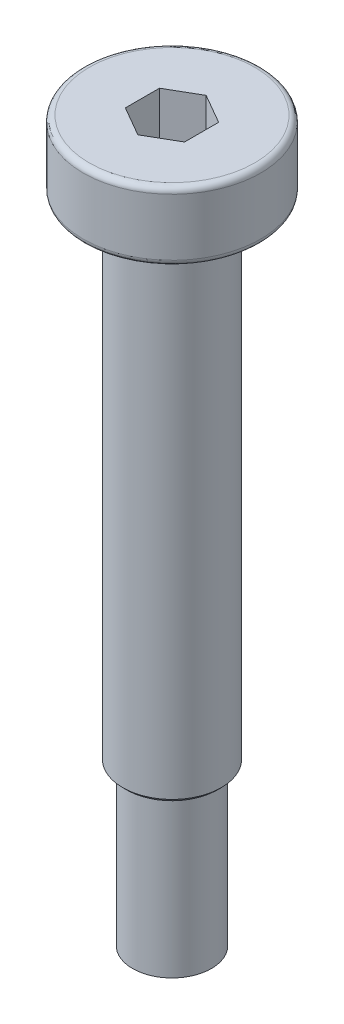
ISO-10303-21;
HEADER;
FILE_DESCRIPTION(('STEP AP214'),'2;1');
FILE_NAME('part.step','',(''),(''),'','','');
FILE_SCHEMA(('AUTOMOTIVE_DESIGN { 1 0 10303 214 1 1 1 1 }'));
ENDSEC;
DATA;
#1=APPLICATION_CONTEXT('core data for automotive mechanical design processes');
#2=APPLICATION_PROTOCOL_DEFINITION('international standard','automotive_design',2000,#1);
#3=PRODUCT_CONTEXT('',#1,'mechanical');
#4=PRODUCT('Part','Part','',(#3));
#5=PRODUCT_RELATED_PRODUCT_CATEGORY('part','',(#4));
#6=PRODUCT_DEFINITION_FORMATION('','',#4);
#7=PRODUCT_DEFINITION_CONTEXT('part definition',#1,'design');
#8=PRODUCT_DEFINITION('design','',#6,#7);
#9=PRODUCT_DEFINITION_SHAPE('','',#8);
#10=(LENGTH_UNIT() NAMED_UNIT(*) SI_UNIT(.MILLI.,.METRE.));
#11=(NAMED_UNIT(*) PLANE_ANGLE_UNIT() SI_UNIT($,.RADIAN.));
#12=(NAMED_UNIT(*) SI_UNIT($,.STERADIAN.) SOLID_ANGLE_UNIT());
#13=UNCERTAINTY_MEASURE_WITH_UNIT(LENGTH_MEASURE(1.E-05),#10,'distance_accuracy_value','');
#14=(GEOMETRIC_REPRESENTATION_CONTEXT(3) GLOBAL_UNCERTAINTY_ASSIGNED_CONTEXT((#13)) GLOBAL_UNIT_ASSIGNED_CONTEXT((#10,
#11,#12)) REPRESENTATION_CONTEXT('',''));
#15=CARTESIAN_POINT('',(0.,0.,0.));
#16=DIRECTION('',(0.,0.,1.));
#17=DIRECTION('',(1.,0.,0.));
#18=AXIS2_PLACEMENT_3D('',#15,#16,#17);
#19=CARTESIAN_POINT('',(0.,9.61644491026167,0.));
#20=DIRECTION('',(0.,1.,0.));
#21=DIRECTION('',(0.,0.,1.));
#22=AXIS2_PLACEMENT_3D('',#19,#20,#21);
#23=PLANE('',#22);
#24=DIRECTION('',(0.,0.,-1.));
#25=VECTOR('',#24,1.);
#26=CARTESIAN_POINT('',(1.5,9.61644491026167,0.86602540378444));
#27=LINE('',#26,#25);
#28=CARTESIAN_POINT('',(1.5,9.61644491026167,0.86602540378444));
#29=VERTEX_POINT('',#28);
#30=CARTESIAN_POINT('',(1.5,9.61644491026167,-0.866025403784439));
#31=VERTEX_POINT('',#30);
#32=EDGE_CURVE('E57',#29,#31,#27,.T.);
#33=ORIENTED_EDGE('',*,*,#32,.F.);
#34=DIRECTION('',(0.866025403784439,0.,-0.5));
#35=VECTOR('',#34,1.);
#36=CARTESIAN_POINT('',(0.,9.61644491026167,1.73205080756888));
#37=LINE('',#36,#35);
#38=CARTESIAN_POINT('',(0.,9.61644491026167,1.73205080756888));
#39=VERTEX_POINT('',#38);
#40=EDGE_CURVE('E140',#39,#29,#37,.T.);
#41=ORIENTED_EDGE('',*,*,#40,.F.);
#42=DIRECTION('',(0.866025403784438,0.,0.5));
#43=VECTOR('',#42,1.);
#44=CARTESIAN_POINT('',(-1.5,9.61644491026167,0.866025403784438));
#45=LINE('',#44,#43);
#46=CARTESIAN_POINT('',(-1.5,9.61644491026167,0.866025403784438));
#47=VERTEX_POINT('',#46);
#48=EDGE_CURVE('E138',#47,#39,#45,.T.);
#49=ORIENTED_EDGE('',*,*,#48,.F.);
#50=DIRECTION('',(0.,0.,1.));
#51=VECTOR('',#50,1.);
#52=CARTESIAN_POINT('',(-1.5,9.61644491026167,-0.866025403784439));
#53=LINE('',#52,#51);
#54=CARTESIAN_POINT('',(-1.5,9.61644491026167,-0.866025403784439));
#55=VERTEX_POINT('',#54);
#56=EDGE_CURVE('E105',#55,#47,#53,.T.);
#57=ORIENTED_EDGE('',*,*,#56,.F.);
#58=DIRECTION('',(-0.866025403784439,0.,0.5));
#59=VECTOR('',#58,1.);
#60=CARTESIAN_POINT('',(0.,9.61644491026167,-1.73205080756888));
#61=LINE('',#60,#59);
#62=CARTESIAN_POINT('',(0.,9.61644491026167,-1.73205080756888));
#63=VERTEX_POINT('',#62);
#64=EDGE_CURVE('E134',#63,#55,#61,.T.);
#65=ORIENTED_EDGE('',*,*,#64,.F.);
#66=DIRECTION('',(-0.866025403784439,0.,-0.5));
#67=VECTOR('',#66,1.);
#68=CARTESIAN_POINT('',(1.5,9.61644491026167,-0.866025403784438));
#69=LINE('',#68,#67);
#70=EDGE_CURVE('E131',#31,#63,#69,.T.);
#71=ORIENTED_EDGE('',*,*,#70,.F.);
#72=EDGE_LOOP('',(#33,#41,#49,#57,#65,#71));
#73=FACE_BOUND('',#72,.T.);
#74=CARTESIAN_POINT('',(0.,9.61644491026167,0.));
#75=DIRECTION('',(0.,1.,0.));
#76=DIRECTION('',(0.,0.,1.));
#77=AXIS2_PLACEMENT_3D('',#74,#75,#76);
#78=CIRCLE('',#77,4.2);
#79=CARTESIAN_POINT('',(0.,9.61644491026167,4.2));
#80=VERTEX_POINT('',#79);
#81=EDGE_CURVE('E167',#80,#80,#78,.T.);
#82=ORIENTED_EDGE('',*,*,#81,.T.);
#83=EDGE_LOOP('',(#82));
#84=FACE_BOUND('',#83,.T.);
#85=ADVANCED_FACE('F41',(#73,#84),#23,.T.);
#86=CARTESIAN_POINT('',(0.,13.2929154984969,0.));
#87=DIRECTION('',(0.,1.,0.));
#88=DIRECTION('',(0.,0.,1.));
#89=AXIS2_PLACEMENT_3D('',#86,#87,#88);
#90=CYLINDRICAL_SURFACE('',#89,4.5);
#91=CARTESIAN_POINT('',(0.,6.41644491026167,0.));
#92=DIRECTION('',(0.,-1.,0.));
#93=DIRECTION('',(0.,0.,-1.));
#94=AXIS2_PLACEMENT_3D('',#91,#92,#93);
#95=CIRCLE('',#94,4.5);
#96=CARTESIAN_POINT('',(0.,6.41644491026167,-4.5));
#97=VERTEX_POINT('',#96);
#98=EDGE_CURVE('E161',#97,#97,#95,.F.);
#99=ORIENTED_EDGE('',*,*,#98,.T.);
#100=EDGE_LOOP('',(#99));
#101=FACE_BOUND('',#100,.T.);
#102=CARTESIAN_POINT('',(0.,9.31644491026167,0.));
#103=DIRECTION('',(0.,1.,0.));
#104=DIRECTION('',(0.,0.,1.));
#105=AXIS2_PLACEMENT_3D('',#102,#103,#104);
#106=CIRCLE('',#105,4.5);
#107=CARTESIAN_POINT('',(0.,9.31644491026167,4.5));
#108=VERTEX_POINT('',#107);
#109=EDGE_CURVE('E158',#108,#108,#106,.F.);
#110=ORIENTED_EDGE('',*,*,#109,.T.);
#111=EDGE_LOOP('',(#110));
#112=FACE_BOUND('',#111,.T.);
#113=ADVANCED_FACE('F184',(#101,#112),#90,.T.);
#114=CARTESIAN_POINT('',(-4.5,6.11644491026167,0.));
#115=DIRECTION('',(0.,-1.,0.));
#116=DIRECTION('',(0.,0.,-1.));
#117=AXIS2_PLACEMENT_3D('',#114,#115,#116);
#118=PLANE('',#117);
#119=CARTESIAN_POINT('',(0.,6.11644491026167,0.));
#120=DIRECTION('',(0.,-1.,0.));
#121=DIRECTION('',(0.,0.,-1.));
#122=AXIS2_PLACEMENT_3D('',#119,#120,#121);
#123=CIRCLE('',#122,4.2);
#124=CARTESIAN_POINT('',(0.,6.11644491026167,-4.2));
#125=VERTEX_POINT('',#124);
#126=EDGE_CURVE('E164',#125,#125,#123,.T.);
#127=ORIENTED_EDGE('',*,*,#126,.T.);
#128=EDGE_LOOP('',(#127));
#129=FACE_BOUND('',#128,.T.);
#130=CARTESIAN_POINT('',(0.,6.11644491026167,0.));
#131=DIRECTION('',(0.,1.,0.));
#132=DIRECTION('',(0.,0.,1.));
#133=AXIS2_PLACEMENT_3D('',#130,#131,#132);
#134=CIRCLE('',#133,2.5);
#135=CARTESIAN_POINT('',(0.,6.11644491026167,2.5));
#136=VERTEX_POINT('',#135);
#137=EDGE_CURVE('E155',#136,#136,#134,.T.);
#138=ORIENTED_EDGE('',*,*,#137,.T.);
#139=EDGE_LOOP('',(#138));
#140=FACE_BOUND('',#139,.T.);
#141=ADVANCED_FACE('F190',(#129,#140),#118,.T.);
#142=CARTESIAN_POINT('',(0.,13.2929154984969,0.));
#143=DIRECTION('',(0.,1.,0.));
#144=DIRECTION('',(0.,0.,1.));
#145=AXIS2_PLACEMENT_3D('',#142,#143,#144);
#146=CYLINDRICAL_SURFACE('',#145,2.5);
#147=CARTESIAN_POINT('',(0.,-18.6835550897383,0.));
#148=DIRECTION('',(0.,-1.,0.));
#149=DIRECTION('',(0.,0.,-1.));
#150=AXIS2_PLACEMENT_3D('',#147,#148,#149);
#151=CIRCLE('',#150,2.5);
#152=CARTESIAN_POINT('',(0.,-18.6835550897383,-2.5));
#153=VERTEX_POINT('',#152);
#154=EDGE_CURVE('E50',#153,#153,#151,.F.);
#155=ORIENTED_EDGE('',*,*,#154,.T.);
#156=EDGE_LOOP('',(#155));
#157=FACE_BOUND('',#156,.T.);
#158=ORIENTED_EDGE('',*,*,#137,.F.);
#159=EDGE_LOOP('',(#158));
#160=FACE_BOUND('',#159,.T.);
#161=ADVANCED_FACE('F172',(#157,#160),#146,.T.);
#162=CARTESIAN_POINT('',(-2.5,-18.8835550897383,0.));
#163=DIRECTION('',(0.,-1.,0.));
#164=DIRECTION('',(0.,0.,-1.));
#165=AXIS2_PLACEMENT_3D('',#162,#163,#164);
#166=PLANE('',#165);
#167=CARTESIAN_POINT('',(0.,-18.8835550897383,0.));
#168=DIRECTION('',(0.,-1.,0.));
#169=DIRECTION('',(0.,0.,-1.));
#170=AXIS2_PLACEMENT_3D('',#167,#168,#169);
#171=CIRCLE('',#170,2.3);
#172=CARTESIAN_POINT('',(0.,-18.8835550897383,-2.3));
#173=VERTEX_POINT('',#172);
#174=EDGE_CURVE('E11',#173,#173,#171,.T.);
#175=ORIENTED_EDGE('',*,*,#174,.T.);
#176=EDGE_LOOP('',(#175));
#177=FACE_BOUND('',#176,.T.);
#178=CARTESIAN_POINT('',(0.,-18.8835550897383,0.));
#179=DIRECTION('',(0.,1.,0.));
#180=DIRECTION('',(0.,0.,1.));
#181=AXIS2_PLACEMENT_3D('',#178,#179,#180);
#182=CIRCLE('',#181,2.);
#183=CARTESIAN_POINT('',(0.,-18.8835550897383,2.));
#184=VERTEX_POINT('',#183);
#185=EDGE_CURVE('E152',#184,#184,#182,.T.);
#186=ORIENTED_EDGE('',*,*,#185,.T.);
#187=EDGE_LOOP('',(#186));
#188=FACE_BOUND('',#187,.T.);
#189=ADVANCED_FACE('F226',(#177,#188),#166,.T.);
#190=CARTESIAN_POINT('',(0.,13.2929154984969,0.));
#191=DIRECTION('',(0.,1.,0.));
#192=DIRECTION('',(0.,0.,1.));
#193=AXIS2_PLACEMENT_3D('',#190,#191,#192);
#194=CYLINDRICAL_SURFACE('',#193,2.);
#195=CARTESIAN_POINT('',(0.,-26.8835550897383,0.));
#196=DIRECTION('',(0.,1.,0.));
#197=DIRECTION('',(0.,0.,1.));
#198=AXIS2_PLACEMENT_3D('',#195,#196,#197);
#199=CIRCLE('',#198,1.99999999999999);
#200=CARTESIAN_POINT('',(0.,-26.8835550897383,1.99999999999999));
#201=VERTEX_POINT('',#200);
#202=EDGE_CURVE('E144',#201,#201,#199,.T.);
#203=ORIENTED_EDGE('',*,*,#202,.T.);
#204=EDGE_LOOP('',(#203));
#205=FACE_BOUND('',#204,.T.);
#206=ORIENTED_EDGE('',*,*,#185,.F.);
#207=EDGE_LOOP('',(#206));
#208=FACE_BOUND('',#207,.T.);
#209=ADVANCED_FACE('F222',(#205,#208),#194,.T.);
#210=CARTESIAN_POINT('',(-1.99999999999999,-26.8835550897383,0.));
#211=DIRECTION('',(0.,-1.,0.));
#212=DIRECTION('',(0.,0.,-1.));
#213=AXIS2_PLACEMENT_3D('',#210,#211,#212);
#214=PLANE('',#213);
#215=ORIENTED_EDGE('',*,*,#202,.F.);
#216=EDGE_LOOP('',(#215));
#217=FACE_BOUND('',#216,.T.);
#218=ADVANCED_FACE('F199',(#217),#214,.T.);
#219=CARTESIAN_POINT('',(0.,6.41644491026167,0.));
#220=DIRECTION('',(0.,-1.,0.));
#221=DIRECTION('',(0.,0.,-1.));
#222=AXIS2_PLACEMENT_3D('',#219,#220,#221);
#223=TOROIDAL_SURFACE('',#222,4.2,0.3);
#224=ORIENTED_EDGE('',*,*,#126,.F.);
#225=EDGE_LOOP('',(#224));
#226=FACE_BOUND('',#225,.T.);
#227=ORIENTED_EDGE('',*,*,#98,.F.);
#228=EDGE_LOOP('',(#227));
#229=FACE_BOUND('',#228,.T.);
#230=ADVANCED_FACE('F196',(#226,#229),#223,.T.);
#231=CARTESIAN_POINT('',(0.,9.31644491026167,0.));
#232=DIRECTION('',(0.,1.,0.));
#233=DIRECTION('',(0.,0.,1.));
#234=AXIS2_PLACEMENT_3D('',#231,#232,#233);
#235=TOROIDAL_SURFACE('',#234,4.2,0.3);
#236=ORIENTED_EDGE('',*,*,#109,.F.);
#237=EDGE_LOOP('',(#236));
#238=FACE_BOUND('',#237,.T.);
#239=ORIENTED_EDGE('',*,*,#81,.F.);
#240=EDGE_LOOP('',(#239));
#241=FACE_BOUND('',#240,.T.);
#242=ADVANCED_FACE('F198',(#238,#241),#235,.T.);
#243=CARTESIAN_POINT('',(1.5,7.21644491026167,0.86602540378444));
#244=DIRECTION('',(1.,0.,0.));
#245=DIRECTION('',(0.,0.,-1.));
#246=AXIS2_PLACEMENT_3D('',#243,#244,#245);
#247=PLANE('',#246);
#248=ORIENTED_EDGE('',*,*,#32,.T.);
#249=DIRECTION('',(0.,1.,0.));
#250=VECTOR('',#249,1.);
#251=CARTESIAN_POINT('',(1.5,7.21644491026167,-0.866025403784438));
#252=LINE('',#251,#250);
#253=CARTESIAN_POINT('',(1.5,7.21644491026167,-0.866025403784438));
#254=VERTEX_POINT('',#253);
#255=EDGE_CURVE('E87',#254,#31,#252,.T.);
#256=ORIENTED_EDGE('',*,*,#255,.F.);
#257=DIRECTION('',(0.,0.,-1.));
#258=VECTOR('',#257,1.);
#259=CARTESIAN_POINT('',(1.5,7.21644491026167,0.86602540378444));
#260=LINE('',#259,#258);
#261=CARTESIAN_POINT('',(1.5,7.21644491026167,0.86602540378444));
#262=VERTEX_POINT('',#261);
#263=EDGE_CURVE('E142',#262,#254,#260,.T.);
#264=ORIENTED_EDGE('',*,*,#263,.F.);
#265=DIRECTION('',(0.,1.,0.));
#266=VECTOR('',#265,1.);
#267=CARTESIAN_POINT('',(1.5,7.21644491026167,0.86602540378444));
#268=LINE('',#267,#266);
#269=EDGE_CURVE('E65',#262,#29,#268,.T.);
#270=ORIENTED_EDGE('',*,*,#269,.T.);
#271=EDGE_LOOP('',(#248,#256,#264,#270));
#272=FACE_BOUND('',#271,.T.);
#273=ADVANCED_FACE('F202',(#272),#247,.F.);
#274=CARTESIAN_POINT('',(0.,7.21644491026167,1.73205080756888));
#275=DIRECTION('',(0.5,0.,0.866025403784439));
#276=DIRECTION('',(0.866025403784439,0.,-0.5));
#277=AXIS2_PLACEMENT_3D('',#274,#275,#276);
#278=PLANE('',#277);
#279=ORIENTED_EDGE('',*,*,#40,.T.);
#280=ORIENTED_EDGE('',*,*,#269,.F.);
#281=DIRECTION('',(0.866025403784439,0.,-0.5));
#282=VECTOR('',#281,1.);
#283=CARTESIAN_POINT('',(0.,7.21644491026167,1.73205080756888));
#284=LINE('',#283,#282);
#285=CARTESIAN_POINT('',(0.,7.21644491026167,1.73205080756888));
#286=VERTEX_POINT('',#285);
#287=EDGE_CURVE('E117',#286,#262,#284,.T.);
#288=ORIENTED_EDGE('',*,*,#287,.F.);
#289=DIRECTION('',(0.,1.,0.));
#290=VECTOR('',#289,1.);
#291=CARTESIAN_POINT('',(0.,7.21644491026167,1.73205080756888));
#292=LINE('',#291,#290);
#293=EDGE_CURVE('E109',#286,#39,#292,.T.);
#294=ORIENTED_EDGE('',*,*,#293,.T.);
#295=EDGE_LOOP('',(#279,#280,#288,#294));
#296=FACE_BOUND('',#295,.T.);
#297=ADVANCED_FACE('F207',(#296),#278,.F.);
#298=CARTESIAN_POINT('',(-1.5,7.21644491026167,0.866025403784438));
#299=DIRECTION('',(-0.5,0.,0.866025403784439));
#300=DIRECTION('',(0.866025403784439,0.,0.5));
#301=AXIS2_PLACEMENT_3D('',#298,#299,#300);
#302=PLANE('',#301);
#303=ORIENTED_EDGE('',*,*,#48,.T.);
#304=ORIENTED_EDGE('',*,*,#293,.F.);
#305=DIRECTION('',(0.866025403784438,0.,0.5));
#306=VECTOR('',#305,1.);
#307=CARTESIAN_POINT('',(-1.5,7.21644491026167,0.866025403784438));
#308=LINE('',#307,#306);
#309=CARTESIAN_POINT('',(-1.5,7.21644491026167,0.866025403784438));
#310=VERTEX_POINT('',#309);
#311=EDGE_CURVE('E113',#310,#286,#308,.T.);
#312=ORIENTED_EDGE('',*,*,#311,.F.);
#313=DIRECTION('',(0.,1.,0.));
#314=VECTOR('',#313,1.);
#315=CARTESIAN_POINT('',(-1.5,7.21644491026167,0.866025403784438));
#316=LINE('',#315,#314);
#317=EDGE_CURVE('E98',#310,#47,#316,.T.);
#318=ORIENTED_EDGE('',*,*,#317,.T.);
#319=EDGE_LOOP('',(#303,#304,#312,#318));
#320=FACE_BOUND('',#319,.T.);
#321=ADVANCED_FACE('F114',(#320),#302,.F.);
#322=CARTESIAN_POINT('',(-1.5,7.21644491026167,-0.866025403784439));
#323=DIRECTION('',(-1.,0.,0.));
#324=DIRECTION('',(0.,0.,1.));
#325=AXIS2_PLACEMENT_3D('',#322,#323,#324);
#326=PLANE('',#325);
#327=ORIENTED_EDGE('',*,*,#56,.T.);
#328=ORIENTED_EDGE('',*,*,#317,.F.);
#329=DIRECTION('',(0.,0.,1.));
#330=VECTOR('',#329,1.);
#331=CARTESIAN_POINT('',(-1.5,7.21644491026167,-0.866025403784439));
#332=LINE('',#331,#330);
#333=CARTESIAN_POINT('',(-1.5,7.21644491026167,-0.866025403784439));
#334=VERTEX_POINT('',#333);
#335=EDGE_CURVE('E102',#334,#310,#332,.T.);
#336=ORIENTED_EDGE('',*,*,#335,.F.);
#337=DIRECTION('',(0.,1.,0.));
#338=VECTOR('',#337,1.);
#339=CARTESIAN_POINT('',(-1.5,7.21644491026167,-0.866025403784439));
#340=LINE('',#339,#338);
#341=EDGE_CURVE('E110',#334,#55,#340,.T.);
#342=ORIENTED_EDGE('',*,*,#341,.T.);
#343=EDGE_LOOP('',(#327,#328,#336,#342));
#344=FACE_BOUND('',#343,.T.);
#345=ADVANCED_FACE('F100',(#344),#326,.F.);
#346=CARTESIAN_POINT('',(0.,7.21644491026167,-1.73205080756888));
#347=DIRECTION('',(-0.5,0.,-0.866025403784439));
#348=DIRECTION('',(-0.866025403784439,0.,0.5));
#349=AXIS2_PLACEMENT_3D('',#346,#347,#348);
#350=PLANE('',#349);
#351=ORIENTED_EDGE('',*,*,#64,.T.);
#352=ORIENTED_EDGE('',*,*,#341,.F.);
#353=DIRECTION('',(-0.866025403784439,0.,0.5));
#354=VECTOR('',#353,1.);
#355=CARTESIAN_POINT('',(0.,7.21644491026167,-1.73205080756888));
#356=LINE('',#355,#354);
#357=CARTESIAN_POINT('',(0.,7.21644491026167,-1.73205080756888));
#358=VERTEX_POINT('',#357);
#359=EDGE_CURVE('E123',#358,#334,#356,.T.);
#360=ORIENTED_EDGE('',*,*,#359,.F.);
#361=DIRECTION('',(0.,1.,0.));
#362=VECTOR('',#361,1.);
#363=CARTESIAN_POINT('',(0.,7.21644491026167,-1.73205080756888));
#364=LINE('',#363,#362);
#365=EDGE_CURVE('E147',#358,#63,#364,.T.);
#366=ORIENTED_EDGE('',*,*,#365,.T.);
#367=EDGE_LOOP('',(#351,#352,#360,#366));
#368=FACE_BOUND('',#367,.T.);
#369=ADVANCED_FACE('F302',(#368),#350,.F.);
#370=CARTESIAN_POINT('',(1.5,7.21644491026167,-0.866025403784438));
#371=DIRECTION('',(0.5,0.,-0.866025403784439));
#372=DIRECTION('',(-0.866025403784439,0.,-0.5));
#373=AXIS2_PLACEMENT_3D('',#370,#371,#372);
#374=PLANE('',#373);
#375=ORIENTED_EDGE('',*,*,#70,.T.);
#376=ORIENTED_EDGE('',*,*,#365,.F.);
#377=DIRECTION('',(-0.866025403784439,0.,-0.5));
#378=VECTOR('',#377,1.);
#379=CARTESIAN_POINT('',(1.5,7.21644491026167,-0.866025403784438));
#380=LINE('',#379,#378);
#381=EDGE_CURVE('E125',#254,#358,#380,.T.);
#382=ORIENTED_EDGE('',*,*,#381,.F.);
#383=ORIENTED_EDGE('',*,*,#255,.T.);
#384=EDGE_LOOP('',(#375,#376,#382,#383));
#385=FACE_BOUND('',#384,.T.);
#386=ADVANCED_FACE('F180',(#385),#374,.F.);
#387=CARTESIAN_POINT('',(0.,7.21644491026167,0.));
#388=DIRECTION('',(0.,1.,0.));
#389=DIRECTION('',(0.,0.,1.));
#390=AXIS2_PLACEMENT_3D('',#387,#388,#389);
#391=PLANE('',#390);
#392=ORIENTED_EDGE('',*,*,#263,.T.);
#393=ORIENTED_EDGE('',*,*,#381,.T.);
#394=ORIENTED_EDGE('',*,*,#359,.T.);
#395=ORIENTED_EDGE('',*,*,#335,.T.);
#396=ORIENTED_EDGE('',*,*,#311,.T.);
#397=ORIENTED_EDGE('',*,*,#287,.T.);
#398=EDGE_LOOP('',(#392,#393,#394,#395,#396,#397));
#399=FACE_BOUND('',#398,.T.);
#400=ADVANCED_FACE('F120',(#399),#391,.T.);
#401=CARTESIAN_POINT('',(0.,-18.6835550897383,0.));
#402=DIRECTION('',(0.,1.,0.));
#403=DIRECTION('',(0.,0.,1.));
#404=AXIS2_PLACEMENT_3D('',#401,#402,#403);
#405=CONICAL_SURFACE('',#404,2.5,0.785398163397438);
#406=ORIENTED_EDGE('',*,*,#174,.F.);
#407=EDGE_LOOP('',(#406));
#408=FACE_BOUND('',#407,.T.);
#409=ORIENTED_EDGE('',*,*,#154,.F.);
#410=EDGE_LOOP('',(#409));
#411=FACE_BOUND('',#410,.T.);
#412=ADVANCED_FACE('F44',(#408,#411),#405,.T.);
#413=CLOSED_SHELL('',(#85,#113,#141,#161,#189,#209,#218,#230,#242,#273,#297,#321,#345,#369,#386,
#400,#412));
#414=MANIFOLD_SOLID_BREP('B2',#413);
#415=ADVANCED_BREP_SHAPE_REPRESENTATION('',(#18,#414),#14);
#416=SHAPE_DEFINITION_REPRESENTATION(#9,#415);
ENDSEC;
END-ISO-10303-21;
